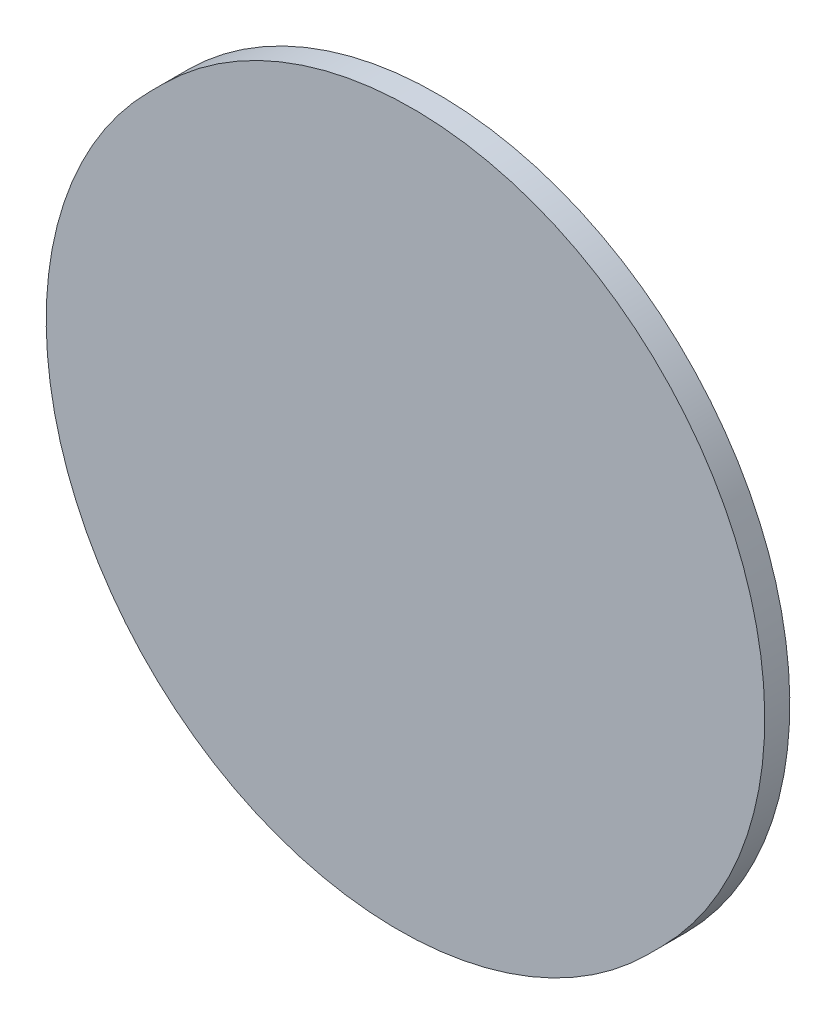
ISO-10303-21;
HEADER;
FILE_DESCRIPTION(('STEP AP214'),'2;1');
FILE_NAME('part.step','',(''),(''),'','','');
FILE_SCHEMA(('AUTOMOTIVE_DESIGN { 1 0 10303 214 1 1 1 1 }'));
ENDSEC;
DATA;
#1=APPLICATION_CONTEXT('core data for automotive mechanical design processes');
#2=APPLICATION_PROTOCOL_DEFINITION('international standard','automotive_design',2000,#1);
#3=PRODUCT_CONTEXT('',#1,'mechanical');
#4=PRODUCT('Part','Part','',(#3));
#5=PRODUCT_RELATED_PRODUCT_CATEGORY('part','',(#4));
#6=PRODUCT_DEFINITION_FORMATION('','',#4);
#7=PRODUCT_DEFINITION_CONTEXT('part definition',#1,'design');
#8=PRODUCT_DEFINITION('design','',#6,#7);
#9=PRODUCT_DEFINITION_SHAPE('','',#8);
#10=(LENGTH_UNIT() NAMED_UNIT(*) SI_UNIT(.MILLI.,.METRE.));
#11=(NAMED_UNIT(*) PLANE_ANGLE_UNIT() SI_UNIT($,.RADIAN.));
#12=(NAMED_UNIT(*) SI_UNIT($,.STERADIAN.) SOLID_ANGLE_UNIT());
#13=UNCERTAINTY_MEASURE_WITH_UNIT(LENGTH_MEASURE(1.E-05),#10,'distance_accuracy_value','');
#14=(GEOMETRIC_REPRESENTATION_CONTEXT(3) GLOBAL_UNCERTAINTY_ASSIGNED_CONTEXT((#13)) GLOBAL_UNIT_ASSIGNED_CONTEXT((#10,
#11,#12)) REPRESENTATION_CONTEXT('',''));
#15=CARTESIAN_POINT('',(0.,0.,0.));
#16=DIRECTION('',(0.,0.,1.));
#17=DIRECTION('',(1.,0.,0.));
#18=AXIS2_PLACEMENT_3D('',#15,#16,#17);
#19=CARTESIAN_POINT('',(57.77355476,76.53224724,0.));
#20=DIRECTION('',(-0.707106781186422,0.707106781186673,0.));
#21=DIRECTION('',(0.707106781186673,0.707106781186422,0.));
#22=AXIS2_PLACEMENT_3D('',#19,#20,#21);
#23=PLANE('',#22);
#24=DIRECTION('',(0.707106781186673,0.707106781186422,0.));
#25=VECTOR('',#24,1.);
#26=CARTESIAN_POINT('',(57.77355476,76.53224724,0.03556));
#27=LINE('',#26,#25);
#28=CARTESIAN_POINT('',(57.77355476,76.53224724,0.03556));
#29=VERTEX_POINT('',#28);
#30=CARTESIAN_POINT('',(57.79356996,76.55226244,0.03556));
#31=VERTEX_POINT('',#30);
#32=EDGE_CURVE('E11',#29,#31,#27,.T.);
#33=ORIENTED_EDGE('',*,*,#32,.F.);
#34=DIRECTION('',(0.,0.,1.));
#35=VECTOR('',#34,1.);
#36=CARTESIAN_POINT('',(57.77355476,76.53224724,0.));
#37=LINE('',#36,#35);
#38=CARTESIAN_POINT('',(57.77355476,76.53224724,0.));
#39=VERTEX_POINT('',#38);
#40=EDGE_CURVE('E24',#39,#29,#37,.T.);
#41=ORIENTED_EDGE('',*,*,#40,.F.);
#42=DIRECTION('',(0.707106781186673,0.707106781186422,0.));
#43=VECTOR('',#42,1.);
#44=CARTESIAN_POINT('',(57.77355476,76.53224724,0.));
#45=LINE('',#44,#43);
#46=CARTESIAN_POINT('',(57.79356996,76.55226244,0.));
#47=VERTEX_POINT('',#46);
#48=EDGE_CURVE('E75',#39,#47,#45,.T.);
#49=ORIENTED_EDGE('',*,*,#48,.T.);
#50=DIRECTION('',(0.,0.,1.));
#51=VECTOR('',#50,1.);
#52=CARTESIAN_POINT('',(57.79356996,76.55226244,0.));
#53=LINE('',#52,#51);
#54=EDGE_CURVE('E37',#47,#31,#53,.T.);
#55=ORIENTED_EDGE('',*,*,#54,.T.);
#56=EDGE_LOOP('',(#33,#41,#49,#55));
#57=FACE_BOUND('',#56,.T.);
#58=ADVANCED_FACE('F17',(#57),#23,.F.);
#59=CARTESIAN_POINT('',(57.4400172,76.9058152,0.));
#60=DIRECTION('',(0.,0.,-1.));
#61=DIRECTION('',(0.70710678118654,-0.707106781186555,0.));
#62=AXIS2_PLACEMENT_3D('',#59,#60,#61);
#63=CYLINDRICAL_SURFACE('',#62,0.499999108206436);
#64=CARTESIAN_POINT('',(57.4400172,76.9058152,0.03556));
#65=DIRECTION('',(0.,0.,1.));
#66=DIRECTION('',(0.70710678118654,-0.707106781186555,0.));
#67=AXIS2_PLACEMENT_3D('',#64,#65,#66);
#68=CIRCLE('',#67,0.499999108206436);
#69=CARTESIAN_POINT('',(57.08646444,77.25936796,0.03556));
#70=VERTEX_POINT('',#69);
#71=EDGE_CURVE('E83',#31,#70,#68,.T.);
#72=ORIENTED_EDGE('',*,*,#71,.F.);
#73=ORIENTED_EDGE('',*,*,#54,.F.);
#74=CARTESIAN_POINT('',(57.4400172,76.9058152,0.));
#75=DIRECTION('',(0.,0.,1.));
#76=DIRECTION('',(0.70710678118654,-0.707106781186555,0.));
#77=AXIS2_PLACEMENT_3D('',#74,#75,#76);
#78=CIRCLE('',#77,0.499999108206436);
#79=CARTESIAN_POINT('',(57.08646444,77.25936796,0.));
#80=VERTEX_POINT('',#79);
#81=EDGE_CURVE('E81',#47,#80,#78,.T.);
#82=ORIENTED_EDGE('',*,*,#81,.T.);
#83=DIRECTION('',(0.,0.,1.));
#84=VECTOR('',#83,1.);
#85=CARTESIAN_POINT('',(57.08646444,77.25936796,0.));
#86=LINE('',#85,#84);
#87=EDGE_CURVE('E67',#80,#70,#86,.T.);
#88=ORIENTED_EDGE('',*,*,#87,.T.);
#89=EDGE_LOOP('',(#72,#73,#82,#88));
#90=FACE_BOUND('',#89,.T.);
#91=ADVANCED_FACE('F89',(#90),#63,.T.);
#92=CARTESIAN_POINT('',(57.08646444,77.25936796,0.));
#93=DIRECTION('',(0.707106781186548,-0.707106781186548,0.));
#94=DIRECTION('',(-0.707106781186548,-0.707106781186548,0.));
#95=AXIS2_PLACEMENT_3D('',#92,#93,#94);
#96=PLANE('',#95);
#97=DIRECTION('',(-0.707106781186548,-0.707106781186548,0.));
#98=VECTOR('',#97,1.);
#99=CARTESIAN_POINT('',(57.08646444,77.25936796,0.03556));
#100=LINE('',#99,#98);
#101=CARTESIAN_POINT('',(57.06644924,77.23935276,0.03556));
#102=VERTEX_POINT('',#101);
#103=EDGE_CURVE('E71',#70,#102,#100,.T.);
#104=ORIENTED_EDGE('',*,*,#103,.F.);
#105=ORIENTED_EDGE('',*,*,#87,.F.);
#106=DIRECTION('',(-0.707106781186548,-0.707106781186548,0.));
#107=VECTOR('',#106,1.);
#108=CARTESIAN_POINT('',(57.08646444,77.25936796,0.));
#109=LINE('',#108,#107);
#110=CARTESIAN_POINT('',(57.06644924,77.23935276,0.));
#111=VERTEX_POINT('',#110);
#112=EDGE_CURVE('E63',#80,#111,#109,.T.);
#113=ORIENTED_EDGE('',*,*,#112,.T.);
#114=DIRECTION('',(0.,0.,1.));
#115=VECTOR('',#114,1.);
#116=CARTESIAN_POINT('',(57.06644924,77.23935276,0.));
#117=LINE('',#116,#115);
#118=EDGE_CURVE('E53',#111,#102,#117,.T.);
#119=ORIENTED_EDGE('',*,*,#118,.T.);
#120=EDGE_LOOP('',(#104,#105,#113,#119));
#121=FACE_BOUND('',#120,.T.);
#122=ADVANCED_FACE('F66',(#121),#96,.F.);
#123=CARTESIAN_POINT('',(57.420002,76.8858,0.));
#124=DIRECTION('',(0.,0.,-1.));
#125=DIRECTION('',(-0.707106781186548,0.707106781186548,0.));
#126=AXIS2_PLACEMENT_3D('',#123,#124,#125);
#127=CYLINDRICAL_SURFACE('',#126,0.499999108206432);
#128=CARTESIAN_POINT('',(57.420002,76.8858,0.03556));
#129=DIRECTION('',(0.,0.,1.));
#130=DIRECTION('',(-0.707106781186548,0.707106781186548,0.));
#131=AXIS2_PLACEMENT_3D('',#128,#129,#130);
#132=CIRCLE('',#131,0.499999108206432);
#133=EDGE_CURVE('E59',#102,#29,#132,.T.);
#134=ORIENTED_EDGE('',*,*,#133,.F.);
#135=ORIENTED_EDGE('',*,*,#118,.F.);
#136=CARTESIAN_POINT('',(57.420002,76.8858,0.));
#137=DIRECTION('',(0.,0.,1.));
#138=DIRECTION('',(-0.707106781186548,0.707106781186548,0.));
#139=AXIS2_PLACEMENT_3D('',#136,#137,#138);
#140=CIRCLE('',#139,0.499999108206432);
#141=EDGE_CURVE('E57',#111,#39,#140,.T.);
#142=ORIENTED_EDGE('',*,*,#141,.T.);
#143=ORIENTED_EDGE('',*,*,#40,.T.);
#144=EDGE_LOOP('',(#134,#135,#142,#143));
#145=FACE_BOUND('',#144,.T.);
#146=ADVANCED_FACE('F55',(#145),#127,.T.);
#147=CARTESIAN_POINT('',(57.77355476,76.53224724,0.));
#148=DIRECTION('',(0.,0.,-1.));
#149=DIRECTION('',(-1.,0.,0.));
#150=AXIS2_PLACEMENT_3D('',#147,#148,#149);
#151=PLANE('',#150);
#152=ORIENTED_EDGE('',*,*,#141,.F.);
#153=ORIENTED_EDGE('',*,*,#112,.F.);
#154=ORIENTED_EDGE('',*,*,#81,.F.);
#155=ORIENTED_EDGE('',*,*,#48,.F.);
#156=EDGE_LOOP('',(#152,#153,#154,#155));
#157=FACE_BOUND('',#156,.T.);
#158=ADVANCED_FACE('F74',(#157),#151,.T.);
#159=CARTESIAN_POINT('',(57.77355476,76.53224724,0.03556));
#160=DIRECTION('',(0.,0.,-1.));
#161=DIRECTION('',(-1.,0.,0.));
#162=AXIS2_PLACEMENT_3D('',#159,#160,#161);
#163=PLANE('',#162);
#164=ORIENTED_EDGE('',*,*,#32,.T.);
#165=ORIENTED_EDGE('',*,*,#71,.T.);
#166=ORIENTED_EDGE('',*,*,#103,.T.);
#167=ORIENTED_EDGE('',*,*,#133,.T.);
#168=EDGE_LOOP('',(#164,#165,#166,#167));
#169=FACE_BOUND('',#168,.T.);
#170=ADVANCED_FACE('F91',(#169),#163,.F.);
#171=CLOSED_SHELL('',(#58,#91,#122,#146,#158,#170));
#172=MANIFOLD_SOLID_BREP('B1',#171);
#173=ADVANCED_BREP_SHAPE_REPRESENTATION('',(#18,#172),#14);
#174=SHAPE_DEFINITION_REPRESENTATION(#9,#173);
ENDSEC;
END-ISO-10303-21;
